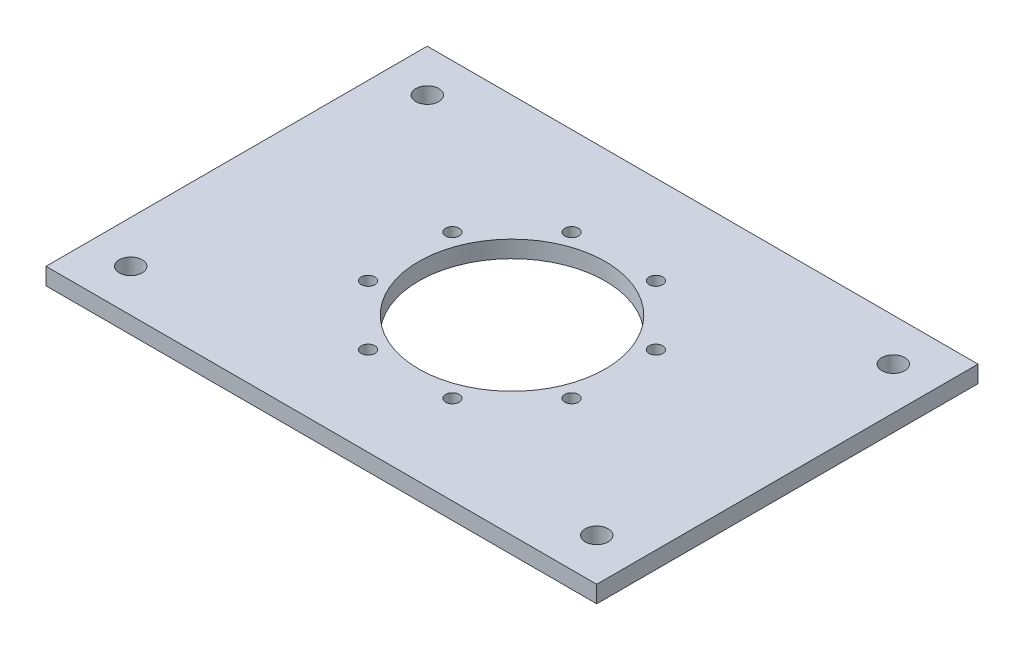
ISO-10303-21;
HEADER;
FILE_DESCRIPTION(('STEP AP214'),'2;1');
FILE_NAME('part.step','',(''),(''),'','','');
FILE_SCHEMA(('AUTOMOTIVE_DESIGN { 1 0 10303 214 1 1 1 1 }'));
ENDSEC;
DATA;
#1=APPLICATION_CONTEXT('core data for automotive mechanical design processes');
#2=APPLICATION_PROTOCOL_DEFINITION('international standard','automotive_design',2000,#1);
#3=PRODUCT_CONTEXT('',#1,'mechanical');
#4=PRODUCT('Part','Part','',(#3));
#5=PRODUCT_RELATED_PRODUCT_CATEGORY('part','',(#4));
#6=PRODUCT_DEFINITION_FORMATION('','',#4);
#7=PRODUCT_DEFINITION_CONTEXT('part definition',#1,'design');
#8=PRODUCT_DEFINITION('design','',#6,#7);
#9=PRODUCT_DEFINITION_SHAPE('','',#8);
#10=(LENGTH_UNIT() NAMED_UNIT(*) SI_UNIT(.MILLI.,.METRE.));
#11=(NAMED_UNIT(*) PLANE_ANGLE_UNIT() SI_UNIT($,.RADIAN.));
#12=(NAMED_UNIT(*) SI_UNIT($,.STERADIAN.) SOLID_ANGLE_UNIT());
#13=UNCERTAINTY_MEASURE_WITH_UNIT(LENGTH_MEASURE(1.E-05),#10,'distance_accuracy_value','');
#14=(GEOMETRIC_REPRESENTATION_CONTEXT(3) GLOBAL_UNCERTAINTY_ASSIGNED_CONTEXT((#13)) GLOBAL_UNIT_ASSIGNED_CONTEXT((#10,
#11,#12)) REPRESENTATION_CONTEXT('',''));
#15=CARTESIAN_POINT('',(0.,0.,0.));
#16=DIRECTION('',(0.,0.,1.));
#17=DIRECTION('',(1.,0.,0.));
#18=AXIS2_PLACEMENT_3D('',#15,#16,#17);
#19=CARTESIAN_POINT('',(0.,10.,0.));
#20=DIRECTION('',(0.,-1.,0.));
#21=DIRECTION('',(0.,0.,-1.));
#22=AXIS2_PLACEMENT_3D('',#19,#20,#21);
#23=PLANE('',#22);
#24=CARTESIAN_POINT('',(-137.5,10.,-87.5));
#25=DIRECTION('',(0.,-1.,0.));
#26=DIRECTION('',(0.,0.,-1.));
#27=AXIS2_PLACEMENT_3D('',#24,#25,#26);
#28=CIRCLE('',#27,6.75);
#29=CARTESIAN_POINT('',(-137.5,10.,-94.25));
#30=VERTEX_POINT('',#29);
#31=EDGE_CURVE('E172',#30,#30,#28,.T.);
#32=ORIENTED_EDGE('',*,*,#31,.T.);
#33=EDGE_LOOP('',(#32));
#34=FACE_BOUND('',#33,.T.);
#35=CARTESIAN_POINT('',(137.5,10.,87.5));
#36=DIRECTION('',(0.,-1.,0.));
#37=DIRECTION('',(0.,0.,-1.));
#38=AXIS2_PLACEMENT_3D('',#35,#36,#37);
#39=CIRCLE('',#38,6.75);
#40=CARTESIAN_POINT('',(137.5,10.,80.75));
#41=VERTEX_POINT('',#40);
#42=EDGE_CURVE('E178',#41,#41,#39,.T.);
#43=ORIENTED_EDGE('',*,*,#42,.T.);
#44=EDGE_LOOP('',(#43));
#45=FACE_BOUND('',#44,.T.);
#46=CARTESIAN_POINT('',(-137.5,10.,87.5));
#47=DIRECTION('',(0.,-1.,0.));
#48=DIRECTION('',(0.,0.,-1.));
#49=AXIS2_PLACEMENT_3D('',#46,#47,#48);
#50=CIRCLE('',#49,6.75);
#51=CARTESIAN_POINT('',(-137.5,10.,80.75));
#52=VERTEX_POINT('',#51);
#53=EDGE_CURVE('E184',#52,#52,#50,.T.);
#54=ORIENTED_EDGE('',*,*,#53,.T.);
#55=EDGE_LOOP('',(#54));
#56=FACE_BOUND('',#55,.T.);
#57=CARTESIAN_POINT('',(137.5,10.,-87.5));
#58=DIRECTION('',(0.,-1.,0.));
#59=DIRECTION('',(0.,0.,-1.));
#60=AXIS2_PLACEMENT_3D('',#57,#58,#59);
#61=CIRCLE('',#60,6.75);
#62=CARTESIAN_POINT('',(137.5,10.,-94.25));
#63=VERTEX_POINT('',#62);
#64=EDGE_CURVE('E166',#63,#63,#61,.T.);
#65=ORIENTED_EDGE('',*,*,#64,.T.);
#66=EDGE_LOOP('',(#65));
#67=FACE_BOUND('',#66,.T.);
#68=CARTESIAN_POINT('',(-60.0521696132337,10.,24.8744231037308));
#69=DIRECTION('',(0.,1.,0.));
#70=DIRECTION('',(0.,0.,1.));
#71=AXIS2_PLACEMENT_3D('',#68,#69,#70);
#72=CIRCLE('',#71,4.00000000000001);
#73=CARTESIAN_POINT('',(-60.0521696132337,10.,28.8744231037308));
#74=VERTEX_POINT('',#73);
#75=EDGE_CURVE('E121',#74,#74,#72,.T.);
#76=ORIENTED_EDGE('',*,*,#75,.F.);
#77=EDGE_LOOP('',(#76));
#78=FACE_BOUND('',#77,.T.);
#79=CARTESIAN_POINT('',(-60.0521696132336,10.,-24.8744231037309));
#80=DIRECTION('',(0.,1.,0.));
#81=DIRECTION('',(0.,0.,1.));
#82=AXIS2_PLACEMENT_3D('',#79,#80,#81);
#83=CIRCLE('',#82,4.);
#84=CARTESIAN_POINT('',(-60.0521696132336,10.,-20.8744231037309));
#85=VERTEX_POINT('',#84);
#86=EDGE_CURVE('E140',#85,#85,#83,.T.);
#87=ORIENTED_EDGE('',*,*,#86,.F.);
#88=EDGE_LOOP('',(#87));
#89=FACE_BOUND('',#88,.T.);
#90=CARTESIAN_POINT('',(-24.8744231037308,10.,-60.0521696132337));
#91=DIRECTION('',(0.,1.,0.));
#92=DIRECTION('',(0.,0.,1.));
#93=AXIS2_PLACEMENT_3D('',#90,#91,#92);
#94=CIRCLE('',#93,4.00000000000001);
#95=CARTESIAN_POINT('',(-24.8744231037308,10.,-56.0521696132337));
#96=VERTEX_POINT('',#95);
#97=EDGE_CURVE('E134',#96,#96,#94,.T.);
#98=ORIENTED_EDGE('',*,*,#97,.F.);
#99=EDGE_LOOP('',(#98));
#100=FACE_BOUND('',#99,.T.);
#101=CARTESIAN_POINT('',(24.8744231037309,10.,-60.0521696132336));
#102=DIRECTION('',(0.,1.,0.));
#103=DIRECTION('',(0.,0.,1.));
#104=AXIS2_PLACEMENT_3D('',#101,#102,#103);
#105=CIRCLE('',#104,4.);
#106=CARTESIAN_POINT('',(24.8744231037309,10.,-56.0521696132336));
#107=VERTEX_POINT('',#106);
#108=EDGE_CURVE('E127',#107,#107,#105,.T.);
#109=ORIENTED_EDGE('',*,*,#108,.F.);
#110=EDGE_LOOP('',(#109));
#111=FACE_BOUND('',#110,.T.);
#112=CARTESIAN_POINT('',(60.0521696132337,10.,-24.8744231037308));
#113=DIRECTION('',(0.,1.,0.));
#114=DIRECTION('',(0.,0.,1.));
#115=AXIS2_PLACEMENT_3D('',#112,#113,#114);
#116=CIRCLE('',#115,4.00000000000001);
#117=CARTESIAN_POINT('',(60.0521696132337,10.,-20.8744231037308));
#118=VERTEX_POINT('',#117);
#119=EDGE_CURVE('E128',#118,#118,#116,.T.);
#120=ORIENTED_EDGE('',*,*,#119,.F.);
#121=EDGE_LOOP('',(#120));
#122=FACE_BOUND('',#121,.T.);
#123=CARTESIAN_POINT('',(60.0521696132336,10.,24.8744231037309));
#124=DIRECTION('',(0.,1.,0.));
#125=DIRECTION('',(0.,0.,1.));
#126=AXIS2_PLACEMENT_3D('',#123,#124,#125);
#127=CIRCLE('',#126,4.00000000000001);
#128=CARTESIAN_POINT('',(60.0521696132336,10.,28.8744231037309));
#129=VERTEX_POINT('',#128);
#130=EDGE_CURVE('E158',#129,#129,#127,.T.);
#131=ORIENTED_EDGE('',*,*,#130,.F.);
#132=EDGE_LOOP('',(#131));
#133=FACE_BOUND('',#132,.T.);
#134=CARTESIAN_POINT('',(24.8744231037308,10.,60.0521696132337));
#135=DIRECTION('',(0.,1.,0.));
#136=DIRECTION('',(0.,0.,1.));
#137=AXIS2_PLACEMENT_3D('',#134,#135,#136);
#138=CIRCLE('',#137,4.00000000000001);
#139=CARTESIAN_POINT('',(24.8744231037308,10.,64.0521696132337));
#140=VERTEX_POINT('',#139);
#141=EDGE_CURVE('E151',#140,#140,#138,.T.);
#142=ORIENTED_EDGE('',*,*,#141,.F.);
#143=EDGE_LOOP('',(#142));
#144=FACE_BOUND('',#143,.T.);
#145=CARTESIAN_POINT('',(-24.8744231037309,10.,60.0521696132336));
#146=DIRECTION('',(0.,1.,0.));
#147=DIRECTION('',(0.,0.,1.));
#148=AXIS2_PLACEMENT_3D('',#145,#146,#147);
#149=CIRCLE('',#148,4.);
#150=CARTESIAN_POINT('',(-24.8744231037309,10.,64.0521696132336));
#151=VERTEX_POINT('',#150);
#152=EDGE_CURVE('E115',#151,#151,#149,.T.);
#153=ORIENTED_EDGE('',*,*,#152,.F.);
#154=EDGE_LOOP('',(#153));
#155=FACE_BOUND('',#154,.T.);
#156=DIRECTION('',(0.,0.,-1.));
#157=VECTOR('',#156,1.);
#158=CARTESIAN_POINT('',(162.5,10.,112.5));
#159=LINE('',#158,#157);
#160=CARTESIAN_POINT('',(162.5,10.,112.5));
#161=VERTEX_POINT('',#160);
#162=CARTESIAN_POINT('',(162.5,10.,-112.5));
#163=VERTEX_POINT('',#162);
#164=EDGE_CURVE('E85',#161,#163,#159,.T.);
#165=ORIENTED_EDGE('',*,*,#164,.T.);
#166=DIRECTION('',(-1.,0.,0.));
#167=VECTOR('',#166,1.);
#168=CARTESIAN_POINT('',(-162.5,10.,-112.5));
#169=LINE('',#168,#167);
#170=CARTESIAN_POINT('',(-162.5,10.,-112.5));
#171=VERTEX_POINT('',#170);
#172=EDGE_CURVE('E80',#163,#171,#169,.T.);
#173=ORIENTED_EDGE('',*,*,#172,.T.);
#174=DIRECTION('',(0.,0.,1.));
#175=VECTOR('',#174,1.);
#176=CARTESIAN_POINT('',(-162.5,10.,112.5));
#177=LINE('',#176,#175);
#178=CARTESIAN_POINT('',(-162.5,10.,112.5));
#179=VERTEX_POINT('',#178);
#180=EDGE_CURVE('E83',#171,#179,#177,.T.);
#181=ORIENTED_EDGE('',*,*,#180,.T.);
#182=DIRECTION('',(1.,0.,0.));
#183=VECTOR('',#182,1.);
#184=CARTESIAN_POINT('',(-162.5,10.,112.5));
#185=LINE('',#184,#183);
#186=EDGE_CURVE('E50',#179,#161,#185,.T.);
#187=ORIENTED_EDGE('',*,*,#186,.T.);
#188=EDGE_LOOP('',(#165,#173,#181,#187));
#189=FACE_BOUND('',#188,.T.);
#190=CARTESIAN_POINT('',(0.,10.,0.));
#191=DIRECTION('',(0.,1.,0.));
#192=DIRECTION('',(0.,0.,1.));
#193=AXIS2_PLACEMENT_3D('',#190,#191,#192);
#194=CIRCLE('',#193,55.);
#195=CARTESIAN_POINT('',(0.,10.,55.));
#196=VERTEX_POINT('',#195);
#197=EDGE_CURVE('E100',#196,#196,#194,.T.);
#198=ORIENTED_EDGE('',*,*,#197,.F.);
#199=EDGE_LOOP('',(#198));
#200=FACE_BOUND('',#199,.T.);
#201=ADVANCED_FACE('F33',(#34,#45,#56,#67,#78,#89,#100,#111,#122,#133,#144,#155,#189,#200),#23,.F.);
#202=CARTESIAN_POINT('',(0.,0.,0.));
#203=DIRECTION('',(0.,-1.,0.));
#204=DIRECTION('',(0.,0.,-1.));
#205=AXIS2_PLACEMENT_3D('',#202,#203,#204);
#206=PLANE('',#205);
#207=CARTESIAN_POINT('',(-137.5,0.,-87.5));
#208=DIRECTION('',(0.,1.,0.));
#209=DIRECTION('',(0.,0.,1.));
#210=AXIS2_PLACEMENT_3D('',#207,#208,#209);
#211=CIRCLE('',#210,6.75);
#212=CARTESIAN_POINT('',(-137.5,0.,-80.75));
#213=VERTEX_POINT('',#212);
#214=EDGE_CURVE('E175',#213,#213,#211,.T.);
#215=ORIENTED_EDGE('',*,*,#214,.T.);
#216=EDGE_LOOP('',(#215));
#217=FACE_BOUND('',#216,.T.);
#218=CARTESIAN_POINT('',(137.5,0.,87.5));
#219=DIRECTION('',(0.,1.,0.));
#220=DIRECTION('',(0.,0.,-1.));
#221=AXIS2_PLACEMENT_3D('',#218,#219,#220);
#222=CIRCLE('',#221,6.75);
#223=CARTESIAN_POINT('',(137.5,0.,80.75));
#224=VERTEX_POINT('',#223);
#225=EDGE_CURVE('E181',#224,#224,#222,.T.);
#226=ORIENTED_EDGE('',*,*,#225,.T.);
#227=EDGE_LOOP('',(#226));
#228=FACE_BOUND('',#227,.T.);
#229=CARTESIAN_POINT('',(-137.5,0.,87.5));
#230=DIRECTION('',(0.,1.,0.));
#231=DIRECTION('',(0.,0.,-1.));
#232=AXIS2_PLACEMENT_3D('',#229,#230,#231);
#233=CIRCLE('',#232,6.75);
#234=CARTESIAN_POINT('',(-137.5,0.,80.75));
#235=VERTEX_POINT('',#234);
#236=EDGE_CURVE('E169',#235,#235,#233,.T.);
#237=ORIENTED_EDGE('',*,*,#236,.T.);
#238=EDGE_LOOP('',(#237));
#239=FACE_BOUND('',#238,.T.);
#240=CARTESIAN_POINT('',(137.5,0.,-87.5));
#241=DIRECTION('',(0.,1.,0.));
#242=DIRECTION('',(0.,0.,1.));
#243=AXIS2_PLACEMENT_3D('',#240,#241,#242);
#244=CIRCLE('',#243,6.75);
#245=CARTESIAN_POINT('',(137.5,0.,-80.75));
#246=VERTEX_POINT('',#245);
#247=EDGE_CURVE('E152',#246,#246,#244,.T.);
#248=ORIENTED_EDGE('',*,*,#247,.T.);
#249=EDGE_LOOP('',(#248));
#250=FACE_BOUND('',#249,.T.);
#251=CARTESIAN_POINT('',(-60.0521696132337,0.,24.8744231037308));
#252=DIRECTION('',(0.,1.,0.));
#253=DIRECTION('',(0.,0.,1.));
#254=AXIS2_PLACEMENT_3D('',#251,#252,#253);
#255=CIRCLE('',#254,4.00000000000001);
#256=CARTESIAN_POINT('',(-60.0521696132337,0.,28.8744231037308));
#257=VERTEX_POINT('',#256);
#258=EDGE_CURVE('E143',#257,#257,#255,.T.);
#259=ORIENTED_EDGE('',*,*,#258,.T.);
#260=EDGE_LOOP('',(#259));
#261=FACE_BOUND('',#260,.T.);
#262=CARTESIAN_POINT('',(-60.0521696132336,0.,-24.8744231037309));
#263=DIRECTION('',(0.,1.,0.));
#264=DIRECTION('',(0.,0.,1.));
#265=AXIS2_PLACEMENT_3D('',#262,#263,#264);
#266=CIRCLE('',#265,4.);
#267=CARTESIAN_POINT('',(-60.0521696132336,0.,-20.8744231037309));
#268=VERTEX_POINT('',#267);
#269=EDGE_CURVE('E137',#268,#268,#266,.T.);
#270=ORIENTED_EDGE('',*,*,#269,.T.);
#271=EDGE_LOOP('',(#270));
#272=FACE_BOUND('',#271,.T.);
#273=CARTESIAN_POINT('',(-24.8744231037308,0.,-60.0521696132337));
#274=DIRECTION('',(0.,1.,0.));
#275=DIRECTION('',(0.,0.,1.));
#276=AXIS2_PLACEMENT_3D('',#273,#274,#275);
#277=CIRCLE('',#276,4.00000000000001);
#278=CARTESIAN_POINT('',(-24.8744231037308,0.,-56.0521696132337));
#279=VERTEX_POINT('',#278);
#280=EDGE_CURVE('E131',#279,#279,#277,.T.);
#281=ORIENTED_EDGE('',*,*,#280,.T.);
#282=EDGE_LOOP('',(#281));
#283=FACE_BOUND('',#282,.T.);
#284=CARTESIAN_POINT('',(24.8744231037309,0.,-60.0521696132336));
#285=DIRECTION('',(0.,1.,0.));
#286=DIRECTION('',(0.,0.,1.));
#287=AXIS2_PLACEMENT_3D('',#284,#285,#286);
#288=CIRCLE('',#287,4.);
#289=CARTESIAN_POINT('',(24.8744231037309,0.,-56.0521696132336));
#290=VERTEX_POINT('',#289);
#291=EDGE_CURVE('E124',#290,#290,#288,.T.);
#292=ORIENTED_EDGE('',*,*,#291,.T.);
#293=EDGE_LOOP('',(#292));
#294=FACE_BOUND('',#293,.T.);
#295=CARTESIAN_POINT('',(60.0521696132337,0.,-24.8744231037308));
#296=DIRECTION('',(0.,1.,0.));
#297=DIRECTION('',(0.,0.,1.));
#298=AXIS2_PLACEMENT_3D('',#295,#296,#297);
#299=CIRCLE('',#298,4.00000000000001);
#300=CARTESIAN_POINT('',(60.0521696132337,0.,-20.8744231037308));
#301=VERTEX_POINT('',#300);
#302=EDGE_CURVE('E161',#301,#301,#299,.T.);
#303=ORIENTED_EDGE('',*,*,#302,.T.);
#304=EDGE_LOOP('',(#303));
#305=FACE_BOUND('',#304,.T.);
#306=CARTESIAN_POINT('',(60.0521696132336,0.,24.8744231037309));
#307=DIRECTION('',(0.,1.,0.));
#308=DIRECTION('',(0.,0.,1.));
#309=AXIS2_PLACEMENT_3D('',#306,#307,#308);
#310=CIRCLE('',#309,4.00000000000001);
#311=CARTESIAN_POINT('',(60.0521696132336,0.,28.8744231037309));
#312=VERTEX_POINT('',#311);
#313=EDGE_CURVE('E155',#312,#312,#310,.T.);
#314=ORIENTED_EDGE('',*,*,#313,.T.);
#315=EDGE_LOOP('',(#314));
#316=FACE_BOUND('',#315,.T.);
#317=CARTESIAN_POINT('',(24.8744231037308,0.,60.0521696132337));
#318=DIRECTION('',(0.,1.,0.));
#319=DIRECTION('',(0.,0.,1.));
#320=AXIS2_PLACEMENT_3D('',#317,#318,#319);
#321=CIRCLE('',#320,4.00000000000001);
#322=CARTESIAN_POINT('',(24.8744231037308,0.,64.0521696132337));
#323=VERTEX_POINT('',#322);
#324=EDGE_CURVE('E148',#323,#323,#321,.T.);
#325=ORIENTED_EDGE('',*,*,#324,.T.);
#326=EDGE_LOOP('',(#325));
#327=FACE_BOUND('',#326,.T.);
#328=CARTESIAN_POINT('',(-24.8744231037309,0.,60.0521696132336));
#329=DIRECTION('',(0.,1.,0.));
#330=DIRECTION('',(0.,0.,1.));
#331=AXIS2_PLACEMENT_3D('',#328,#329,#330);
#332=CIRCLE('',#331,4.);
#333=CARTESIAN_POINT('',(-24.8744231037309,0.,64.0521696132336));
#334=VERTEX_POINT('',#333);
#335=EDGE_CURVE('E118',#334,#334,#332,.T.);
#336=ORIENTED_EDGE('',*,*,#335,.T.);
#337=EDGE_LOOP('',(#336));
#338=FACE_BOUND('',#337,.T.);
#339=DIRECTION('',(0.,0.,-1.));
#340=VECTOR('',#339,1.);
#341=CARTESIAN_POINT('',(162.5,0.,112.5));
#342=LINE('',#341,#340);
#343=CARTESIAN_POINT('',(162.5,0.,112.5));
#344=VERTEX_POINT('',#343);
#345=CARTESIAN_POINT('',(162.5,0.,-112.5));
#346=VERTEX_POINT('',#345);
#347=EDGE_CURVE('E97',#344,#346,#342,.T.);
#348=ORIENTED_EDGE('',*,*,#347,.F.);
#349=DIRECTION('',(1.,0.,0.));
#350=VECTOR('',#349,1.);
#351=CARTESIAN_POINT('',(-162.5,0.,112.5));
#352=LINE('',#351,#350);
#353=CARTESIAN_POINT('',(-162.5,0.,112.5));
#354=VERTEX_POINT('',#353);
#355=EDGE_CURVE('E73',#354,#344,#352,.T.);
#356=ORIENTED_EDGE('',*,*,#355,.F.);
#357=DIRECTION('',(0.,0.,1.));
#358=VECTOR('',#357,1.);
#359=CARTESIAN_POINT('',(-162.5,0.,112.5));
#360=LINE('',#359,#358);
#361=CARTESIAN_POINT('',(-162.5,0.,-112.5));
#362=VERTEX_POINT('',#361);
#363=EDGE_CURVE('E67',#362,#354,#360,.T.);
#364=ORIENTED_EDGE('',*,*,#363,.F.);
#365=DIRECTION('',(-1.,0.,0.));
#366=VECTOR('',#365,1.);
#367=CARTESIAN_POINT('',(-162.5,0.,-112.5));
#368=LINE('',#367,#366);
#369=EDGE_CURVE('E89',#346,#362,#368,.T.);
#370=ORIENTED_EDGE('',*,*,#369,.F.);
#371=EDGE_LOOP('',(#348,#356,#364,#370));
#372=FACE_BOUND('',#371,.T.);
#373=CARTESIAN_POINT('',(0.,0.,0.));
#374=DIRECTION('',(0.,1.,0.));
#375=DIRECTION('',(0.,0.,1.));
#376=AXIS2_PLACEMENT_3D('',#373,#374,#375);
#377=CIRCLE('',#376,55.);
#378=CARTESIAN_POINT('',(0.,0.,55.));
#379=VERTEX_POINT('',#378);
#380=EDGE_CURVE('E112',#379,#379,#377,.T.);
#381=ORIENTED_EDGE('',*,*,#380,.T.);
#382=EDGE_LOOP('',(#381));
#383=FACE_BOUND('',#382,.T.);
#384=ADVANCED_FACE('F108',(#217,#228,#239,#250,#261,#272,#283,#294,#305,#316,#327,#338,#372,
#383),#206,.T.);
#385=CARTESIAN_POINT('',(162.5,10.,112.5));
#386=DIRECTION('',(-1.,0.,0.));
#387=DIRECTION('',(0.,0.,1.));
#388=AXIS2_PLACEMENT_3D('',#385,#386,#387);
#389=PLANE('',#388);
#390=ORIENTED_EDGE('',*,*,#347,.T.);
#391=DIRECTION('',(0.,-1.,0.));
#392=VECTOR('',#391,1.);
#393=CARTESIAN_POINT('',(162.5,10.,-112.5));
#394=LINE('',#393,#392);
#395=EDGE_CURVE('E11',#163,#346,#394,.T.);
#396=ORIENTED_EDGE('',*,*,#395,.F.);
#397=ORIENTED_EDGE('',*,*,#164,.F.);
#398=DIRECTION('',(0.,-1.,0.));
#399=VECTOR('',#398,1.);
#400=CARTESIAN_POINT('',(162.5,10.,112.5));
#401=LINE('',#400,#399);
#402=EDGE_CURVE('E93',#161,#344,#401,.T.);
#403=ORIENTED_EDGE('',*,*,#402,.T.);
#404=EDGE_LOOP('',(#390,#396,#397,#403));
#405=FACE_BOUND('',#404,.T.);
#406=ADVANCED_FACE('F35',(#405),#389,.F.);
#407=CARTESIAN_POINT('',(-162.5,10.,-112.5));
#408=DIRECTION('',(0.,0.,1.));
#409=DIRECTION('',(1.,0.,0.));
#410=AXIS2_PLACEMENT_3D('',#407,#408,#409);
#411=PLANE('',#410);
#412=ORIENTED_EDGE('',*,*,#369,.T.);
#413=DIRECTION('',(0.,-1.,0.));
#414=VECTOR('',#413,1.);
#415=CARTESIAN_POINT('',(-162.5,10.,-112.5));
#416=LINE('',#415,#414);
#417=EDGE_CURVE('E42',#171,#362,#416,.T.);
#418=ORIENTED_EDGE('',*,*,#417,.F.);
#419=ORIENTED_EDGE('',*,*,#172,.F.);
#420=ORIENTED_EDGE('',*,*,#395,.T.);
#421=EDGE_LOOP('',(#412,#418,#419,#420));
#422=FACE_BOUND('',#421,.T.);
#423=ADVANCED_FACE('F88',(#422),#411,.F.);
#424=CARTESIAN_POINT('',(-162.5,10.,112.5));
#425=DIRECTION('',(1.,0.,0.));
#426=DIRECTION('',(0.,0.,-1.));
#427=AXIS2_PLACEMENT_3D('',#424,#425,#426);
#428=PLANE('',#427);
#429=ORIENTED_EDGE('',*,*,#363,.T.);
#430=DIRECTION('',(0.,-1.,0.));
#431=VECTOR('',#430,1.);
#432=CARTESIAN_POINT('',(-162.5,10.,112.5));
#433=LINE('',#432,#431);
#434=EDGE_CURVE('E90',#179,#354,#433,.T.);
#435=ORIENTED_EDGE('',*,*,#434,.F.);
#436=ORIENTED_EDGE('',*,*,#180,.F.);
#437=ORIENTED_EDGE('',*,*,#417,.T.);
#438=EDGE_LOOP('',(#429,#435,#436,#437));
#439=FACE_BOUND('',#438,.T.);
#440=ADVANCED_FACE('F91',(#439),#428,.F.);
#441=CARTESIAN_POINT('',(-162.5,10.,112.5));
#442=DIRECTION('',(0.,0.,-1.));
#443=DIRECTION('',(-1.,0.,0.));
#444=AXIS2_PLACEMENT_3D('',#441,#442,#443);
#445=PLANE('',#444);
#446=ORIENTED_EDGE('',*,*,#355,.T.);
#447=ORIENTED_EDGE('',*,*,#402,.F.);
#448=ORIENTED_EDGE('',*,*,#186,.F.);
#449=ORIENTED_EDGE('',*,*,#434,.T.);
#450=EDGE_LOOP('',(#446,#447,#448,#449));
#451=FACE_BOUND('',#450,.T.);
#452=ADVANCED_FACE('F105',(#451),#445,.F.);
#453=CARTESIAN_POINT('',(0.,10.,0.));
#454=DIRECTION('',(0.,-1.,0.));
#455=DIRECTION('',(0.,0.,-1.));
#456=AXIS2_PLACEMENT_3D('',#453,#454,#455);
#457=CYLINDRICAL_SURFACE('',#456,55.);
#458=ORIENTED_EDGE('',*,*,#197,.T.);
#459=EDGE_LOOP('',(#458));
#460=FACE_BOUND('',#459,.T.);
#461=ORIENTED_EDGE('',*,*,#380,.F.);
#462=EDGE_LOOP('',(#461));
#463=FACE_BOUND('',#462,.T.);
#464=ADVANCED_FACE('F226',(#460,#463),#457,.F.);
#465=CARTESIAN_POINT('',(-24.8744231037309,10.,60.0521696132336));
#466=DIRECTION('',(0.,-1.,0.));
#467=DIRECTION('',(0.,0.,-1.));
#468=AXIS2_PLACEMENT_3D('',#465,#466,#467);
#469=CYLINDRICAL_SURFACE('',#468,4.);
#470=ORIENTED_EDGE('',*,*,#152,.T.);
#471=EDGE_LOOP('',(#470));
#472=FACE_BOUND('',#471,.T.);
#473=ORIENTED_EDGE('',*,*,#335,.F.);
#474=EDGE_LOOP('',(#473));
#475=FACE_BOUND('',#474,.T.);
#476=ADVANCED_FACE('F222',(#472,#475),#469,.F.);
#477=CARTESIAN_POINT('',(24.8744231037308,10.,60.0521696132337));
#478=DIRECTION('',(0.,-1.,0.));
#479=DIRECTION('',(0.,0.,-1.));
#480=AXIS2_PLACEMENT_3D('',#477,#478,#479);
#481=CYLINDRICAL_SURFACE('',#480,4.00000000000001);
#482=ORIENTED_EDGE('',*,*,#141,.T.);
#483=EDGE_LOOP('',(#482));
#484=FACE_BOUND('',#483,.T.);
#485=ORIENTED_EDGE('',*,*,#324,.F.);
#486=EDGE_LOOP('',(#485));
#487=FACE_BOUND('',#486,.T.);
#488=ADVANCED_FACE('F225',(#484,#487),#481,.F.);
#489=CARTESIAN_POINT('',(60.0521696132336,10.,24.8744231037309));
#490=DIRECTION('',(0.,-1.,0.));
#491=DIRECTION('',(0.,0.,-1.));
#492=AXIS2_PLACEMENT_3D('',#489,#490,#491);
#493=CYLINDRICAL_SURFACE('',#492,4.00000000000001);
#494=ORIENTED_EDGE('',*,*,#130,.T.);
#495=EDGE_LOOP('',(#494));
#496=FACE_BOUND('',#495,.T.);
#497=ORIENTED_EDGE('',*,*,#313,.F.);
#498=EDGE_LOOP('',(#497));
#499=FACE_BOUND('',#498,.T.);
#500=ADVANCED_FACE('F271',(#496,#499),#493,.F.);
#501=CARTESIAN_POINT('',(60.0521696132337,10.,-24.8744231037308));
#502=DIRECTION('',(0.,-1.,0.));
#503=DIRECTION('',(0.,0.,-1.));
#504=AXIS2_PLACEMENT_3D('',#501,#502,#503);
#505=CYLINDRICAL_SURFACE('',#504,4.00000000000001);
#506=ORIENTED_EDGE('',*,*,#119,.T.);
#507=EDGE_LOOP('',(#506));
#508=FACE_BOUND('',#507,.T.);
#509=ORIENTED_EDGE('',*,*,#302,.F.);
#510=EDGE_LOOP('',(#509));
#511=FACE_BOUND('',#510,.T.);
#512=ADVANCED_FACE('F279',(#508,#511),#505,.F.);
#513=CARTESIAN_POINT('',(24.8744231037309,10.,-60.0521696132336));
#514=DIRECTION('',(0.,-1.,0.));
#515=DIRECTION('',(0.,0.,-1.));
#516=AXIS2_PLACEMENT_3D('',#513,#514,#515);
#517=CYLINDRICAL_SURFACE('',#516,4.);
#518=ORIENTED_EDGE('',*,*,#108,.T.);
#519=EDGE_LOOP('',(#518));
#520=FACE_BOUND('',#519,.T.);
#521=ORIENTED_EDGE('',*,*,#291,.F.);
#522=EDGE_LOOP('',(#521));
#523=FACE_BOUND('',#522,.T.);
#524=ADVANCED_FACE('F287',(#520,#523),#517,.F.);
#525=CARTESIAN_POINT('',(-24.8744231037308,10.,-60.0521696132337));
#526=DIRECTION('',(0.,-1.,0.));
#527=DIRECTION('',(0.,0.,-1.));
#528=AXIS2_PLACEMENT_3D('',#525,#526,#527);
#529=CYLINDRICAL_SURFACE('',#528,4.00000000000001);
#530=ORIENTED_EDGE('',*,*,#97,.T.);
#531=EDGE_LOOP('',(#530));
#532=FACE_BOUND('',#531,.T.);
#533=ORIENTED_EDGE('',*,*,#280,.F.);
#534=EDGE_LOOP('',(#533));
#535=FACE_BOUND('',#534,.T.);
#536=ADVANCED_FACE('F295',(#532,#535),#529,.F.);
#537=CARTESIAN_POINT('',(-60.0521696132336,10.,-24.8744231037309));
#538=DIRECTION('',(0.,-1.,0.));
#539=DIRECTION('',(0.,0.,-1.));
#540=AXIS2_PLACEMENT_3D('',#537,#538,#539);
#541=CYLINDRICAL_SURFACE('',#540,4.);
#542=ORIENTED_EDGE('',*,*,#86,.T.);
#543=EDGE_LOOP('',(#542));
#544=FACE_BOUND('',#543,.T.);
#545=ORIENTED_EDGE('',*,*,#269,.F.);
#546=EDGE_LOOP('',(#545));
#547=FACE_BOUND('',#546,.T.);
#548=ADVANCED_FACE('F303',(#544,#547),#541,.F.);
#549=CARTESIAN_POINT('',(-60.0521696132337,10.,24.8744231037308));
#550=DIRECTION('',(0.,-1.,0.));
#551=DIRECTION('',(0.,0.,-1.));
#552=AXIS2_PLACEMENT_3D('',#549,#550,#551);
#553=CYLINDRICAL_SURFACE('',#552,4.00000000000001);
#554=ORIENTED_EDGE('',*,*,#75,.T.);
#555=EDGE_LOOP('',(#554));
#556=FACE_BOUND('',#555,.T.);
#557=ORIENTED_EDGE('',*,*,#258,.F.);
#558=EDGE_LOOP('',(#557));
#559=FACE_BOUND('',#558,.T.);
#560=ADVANCED_FACE('F311',(#556,#559),#553,.F.);
#561=CARTESIAN_POINT('',(137.5,10.001,-87.5));
#562=DIRECTION('',(0.,-1.,0.));
#563=DIRECTION('',(0.,0.,-1.));
#564=AXIS2_PLACEMENT_3D('',#561,#562,#563);
#565=CYLINDRICAL_SURFACE('',#564,6.75);
#566=ORIENTED_EDGE('',*,*,#247,.F.);
#567=EDGE_LOOP('',(#566));
#568=FACE_BOUND('',#567,.T.);
#569=ORIENTED_EDGE('',*,*,#64,.F.);
#570=EDGE_LOOP('',(#569));
#571=FACE_BOUND('',#570,.T.);
#572=ADVANCED_FACE('F196',(#568,#571),#565,.F.);
#573=CARTESIAN_POINT('',(-137.5,10.001,87.5));
#574=DIRECTION('',(0.,-1.,0.));
#575=DIRECTION('',(0.,0.,-1.));
#576=AXIS2_PLACEMENT_3D('',#573,#574,#575);
#577=CYLINDRICAL_SURFACE('',#576,6.75);
#578=ORIENTED_EDGE('',*,*,#236,.F.);
#579=EDGE_LOOP('',(#578));
#580=FACE_BOUND('',#579,.T.);
#581=ORIENTED_EDGE('',*,*,#53,.F.);
#582=EDGE_LOOP('',(#581));
#583=FACE_BOUND('',#582,.T.);
#584=ADVANCED_FACE('F192',(#580,#583),#577,.F.);
#585=CARTESIAN_POINT('',(137.5,10.001,87.5));
#586=DIRECTION('',(0.,-1.,0.));
#587=DIRECTION('',(0.,0.,-1.));
#588=AXIS2_PLACEMENT_3D('',#585,#586,#587);
#589=CYLINDRICAL_SURFACE('',#588,6.75);
#590=ORIENTED_EDGE('',*,*,#225,.F.);
#591=EDGE_LOOP('',(#590));
#592=FACE_BOUND('',#591,.T.);
#593=ORIENTED_EDGE('',*,*,#42,.F.);
#594=EDGE_LOOP('',(#593));
#595=FACE_BOUND('',#594,.T.);
#596=ADVANCED_FACE('F195',(#592,#595),#589,.F.);
#597=CARTESIAN_POINT('',(-137.5,10.001,-87.5));
#598=DIRECTION('',(0.,-1.,0.));
#599=DIRECTION('',(0.,0.,-1.));
#600=AXIS2_PLACEMENT_3D('',#597,#598,#599);
#601=CYLINDRICAL_SURFACE('',#600,6.75);
#602=ORIENTED_EDGE('',*,*,#214,.F.);
#603=EDGE_LOOP('',(#602));
#604=FACE_BOUND('',#603,.T.);
#605=ORIENTED_EDGE('',*,*,#31,.F.);
#606=EDGE_LOOP('',(#605));
#607=FACE_BOUND('',#606,.T.);
#608=ADVANCED_FACE('F338',(#604,#607),#601,.F.);
#609=CLOSED_SHELL('',(#201,#384,#406,#423,#440,#452,#464,#476,#488,#500,#512,#524,#536,#548,
#560,#572,#584,#596,#608));
#610=MANIFOLD_SOLID_BREP('B2',#609);
#611=ADVANCED_BREP_SHAPE_REPRESENTATION('',(#18,#610),#14);
#612=SHAPE_DEFINITION_REPRESENTATION(#9,#611);
ENDSEC;
END-ISO-10303-21;
